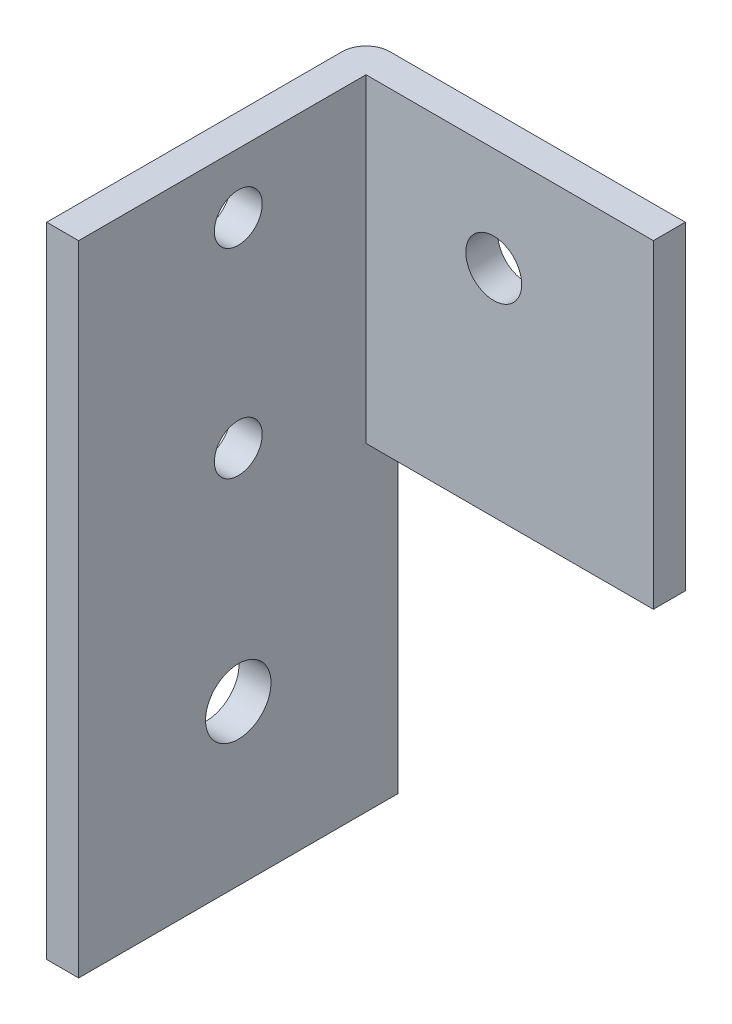
ISO-10303-21;
HEADER;
FILE_DESCRIPTION(('STEP AP214'),'2;1');
FILE_NAME('part.step','',(''),(''),'','','');
FILE_SCHEMA(('AUTOMOTIVE_DESIGN { 1 0 10303 214 1 1 1 1 }'));
ENDSEC;
DATA;
#1=APPLICATION_CONTEXT('core data for automotive mechanical design processes');
#2=APPLICATION_PROTOCOL_DEFINITION('international standard','automotive_design',2000,#1);
#3=PRODUCT_CONTEXT('',#1,'mechanical');
#4=PRODUCT('Part','Part','',(#3));
#5=PRODUCT_RELATED_PRODUCT_CATEGORY('part','',(#4));
#6=PRODUCT_DEFINITION_FORMATION('','',#4);
#7=PRODUCT_DEFINITION_CONTEXT('part definition',#1,'design');
#8=PRODUCT_DEFINITION('design','',#6,#7);
#9=PRODUCT_DEFINITION_SHAPE('','',#8);
#10=(LENGTH_UNIT() NAMED_UNIT(*) SI_UNIT(.MILLI.,.METRE.));
#11=(NAMED_UNIT(*) PLANE_ANGLE_UNIT() SI_UNIT($,.RADIAN.));
#12=(NAMED_UNIT(*) SI_UNIT($,.STERADIAN.) SOLID_ANGLE_UNIT());
#13=UNCERTAINTY_MEASURE_WITH_UNIT(LENGTH_MEASURE(1.E-05),#10,'distance_accuracy_value','');
#14=(GEOMETRIC_REPRESENTATION_CONTEXT(3) GLOBAL_UNCERTAINTY_ASSIGNED_CONTEXT((#13)) GLOBAL_UNIT_ASSIGNED_CONTEXT((#10,
#11,#12)) REPRESENTATION_CONTEXT('',''));
#15=CARTESIAN_POINT('',(0.,0.,0.));
#16=DIRECTION('',(0.,0.,1.));
#17=DIRECTION('',(1.,0.,0.));
#18=AXIS2_PLACEMENT_3D('',#15,#16,#17);
#19=CARTESIAN_POINT('',(-19.6589595375722,80.,-19.121387283237));
#20=DIRECTION('',(0.,0.,-1.));
#21=DIRECTION('',(-1.,0.,0.));
#22=AXIS2_PLACEMENT_3D('',#19,#20,#21);
#23=PLANE('',#22);
#24=CARTESIAN_POINT('',(-2.65895953757226,67.,-19.121387283237));
#25=DIRECTION('',(0.,0.,-1.));
#26=DIRECTION('',(-1.,0.,0.));
#27=AXIS2_PLACEMENT_3D('',#24,#25,#26);
#28=CIRCLE('',#27,3.49999999999999);
#29=CARTESIAN_POINT('',(-6.15895953757225,67.,-19.121387283237));
#30=VERTEX_POINT('',#29);
#31=EDGE_CURVE('E183',#30,#30,#28,.T.);
#32=ORIENTED_EDGE('',*,*,#31,.T.);
#33=EDGE_LOOP('',(#32));
#34=FACE_BOUND('',#33,.T.);
#35=DIRECTION('',(0.,-1.,0.));
#36=VECTOR('',#35,1.);
#37=CARTESIAN_POINT('',(-18.6589595375723,80.,-19.121387283237));
#38=LINE('',#37,#36);
#39=CARTESIAN_POINT('',(-18.6589595375723,80.,-19.121387283237));
#40=VERTEX_POINT('',#39);
#41=CARTESIAN_POINT('',(-18.6589595375723,40.,-19.121387283237));
#42=VERTEX_POINT('',#41);
#43=EDGE_CURVE('E114',#40,#42,#38,.T.);
#44=ORIENTED_EDGE('',*,*,#43,.T.);
#45=DIRECTION('',(1.,0.,0.));
#46=VECTOR('',#45,1.);
#47=CARTESIAN_POINT('',(-19.6589595375722,40.,-19.121387283237));
#48=LINE('',#47,#46);
#49=CARTESIAN_POINT('',(17.3410404624277,40.,-19.121387283237));
#50=VERTEX_POINT('',#49);
#51=EDGE_CURVE('E196',#42,#50,#48,.T.);
#52=ORIENTED_EDGE('',*,*,#51,.T.);
#53=DIRECTION('',(0.,-1.,0.));
#54=VECTOR('',#53,1.);
#55=CARTESIAN_POINT('',(17.3410404624277,80.,-19.121387283237));
#56=LINE('',#55,#54);
#57=CARTESIAN_POINT('',(17.3410404624277,80.,-19.121387283237));
#58=VERTEX_POINT('',#57);
#59=EDGE_CURVE('E11',#58,#50,#56,.T.);
#60=ORIENTED_EDGE('',*,*,#59,.F.);
#61=DIRECTION('',(1.,0.,0.));
#62=VECTOR('',#61,1.);
#63=CARTESIAN_POINT('',(-19.6589595375722,80.,-19.121387283237));
#64=LINE('',#63,#62);
#65=EDGE_CURVE('E83',#40,#58,#64,.T.);
#66=ORIENTED_EDGE('',*,*,#65,.F.);
#67=EDGE_LOOP('',(#44,#52,#60,#66));
#68=FACE_BOUND('',#67,.T.);
#69=ADVANCED_FACE('F34',(#34,#68),#23,.F.);
#70=CARTESIAN_POINT('',(17.3410404624277,80.,-23.121387283237));
#71=DIRECTION('',(1.,0.,0.));
#72=DIRECTION('',(0.,0.,-1.));
#73=AXIS2_PLACEMENT_3D('',#70,#71,#72);
#74=PLANE('',#73);
#75=DIRECTION('',(0.,0.,1.));
#76=VECTOR('',#75,1.);
#77=CARTESIAN_POINT('',(17.3410404624277,40.,-23.121387283237));
#78=LINE('',#77,#76);
#79=CARTESIAN_POINT('',(17.3410404624277,40.,-23.121387283237));
#80=VERTEX_POINT('',#79);
#81=EDGE_CURVE('E194',#80,#50,#78,.T.);
#82=ORIENTED_EDGE('',*,*,#81,.F.);
#83=DIRECTION('',(0.,-1.,0.));
#84=VECTOR('',#83,1.);
#85=CARTESIAN_POINT('',(17.3410404624277,80.,-23.121387283237));
#86=LINE('',#85,#84);
#87=CARTESIAN_POINT('',(17.3410404624277,80.,-23.121387283237));
#88=VERTEX_POINT('',#87);
#89=EDGE_CURVE('E43',#88,#80,#86,.T.);
#90=ORIENTED_EDGE('',*,*,#89,.F.);
#91=DIRECTION('',(0.,0.,1.));
#92=VECTOR('',#91,1.);
#93=CARTESIAN_POINT('',(17.3410404624277,80.,-23.121387283237));
#94=LINE('',#93,#92);
#95=EDGE_CURVE('E157',#88,#58,#94,.T.);
#96=ORIENTED_EDGE('',*,*,#95,.T.);
#97=ORIENTED_EDGE('',*,*,#59,.T.);
#98=EDGE_LOOP('',(#82,#90,#96,#97));
#99=FACE_BOUND('',#98,.T.);
#100=ADVANCED_FACE('F229',(#99),#74,.T.);
#101=CARTESIAN_POINT('',(-19.6589595375722,80.,-23.121387283237));
#102=DIRECTION('',(0.,0.,-1.));
#103=DIRECTION('',(-1.,0.,0.));
#104=AXIS2_PLACEMENT_3D('',#101,#102,#103);
#105=PLANE('',#104);
#106=CARTESIAN_POINT('',(-2.65895953757226,67.,-23.121387283237));
#107=DIRECTION('',(0.,0.,-1.));
#108=DIRECTION('',(-1.,0.,0.));
#109=AXIS2_PLACEMENT_3D('',#106,#107,#108);
#110=CIRCLE('',#109,3.5);
#111=CARTESIAN_POINT('',(-6.15895953757226,67.,-23.121387283237));
#112=VERTEX_POINT('',#111);
#113=EDGE_CURVE('E188',#112,#112,#110,.T.);
#114=ORIENTED_EDGE('',*,*,#113,.F.);
#115=EDGE_LOOP('',(#114));
#116=FACE_BOUND('',#115,.T.);
#117=DIRECTION('',(0.,1.,0.));
#118=VECTOR('',#117,1.);
#119=CARTESIAN_POINT('',(-18.6589595375723,40.,-23.121387283237));
#120=LINE('',#119,#118);
#121=CARTESIAN_POINT('',(-18.6589595375723,0.,-23.121387283237));
#122=VERTEX_POINT('',#121);
#123=CARTESIAN_POINT('',(-18.6589595375723,40.,-23.121387283237));
#124=VERTEX_POINT('',#123);
#125=EDGE_CURVE('E175',#122,#124,#120,.T.);
#126=ORIENTED_EDGE('',*,*,#125,.F.);
#127=DIRECTION('',(1.,0.,0.));
#128=VECTOR('',#127,1.);
#129=CARTESIAN_POINT('',(-19.6589595375722,0.,-23.121387283237));
#130=LINE('',#129,#128);
#131=CARTESIAN_POINT('',(-19.6589595375722,0.,-23.121387283237));
#132=VERTEX_POINT('',#131);
#133=EDGE_CURVE('E118',#132,#122,#130,.T.);
#134=ORIENTED_EDGE('',*,*,#133,.F.);
#135=DIRECTION('',(0.,-1.,0.));
#136=VECTOR('',#135,1.);
#137=CARTESIAN_POINT('',(-19.6589595375722,80.,-23.121387283237));
#138=LINE('',#137,#136);
#139=CARTESIAN_POINT('',(-19.6589595375722,80.,-23.121387283237));
#140=VERTEX_POINT('',#139);
#141=EDGE_CURVE('E134',#140,#132,#138,.T.);
#142=ORIENTED_EDGE('',*,*,#141,.F.);
#143=DIRECTION('',(1.,0.,0.));
#144=VECTOR('',#143,1.);
#145=CARTESIAN_POINT('',(-19.6589595375722,80.,-23.121387283237));
#146=LINE('',#145,#144);
#147=EDGE_CURVE('E160',#140,#88,#146,.T.);
#148=ORIENTED_EDGE('',*,*,#147,.T.);
#149=ORIENTED_EDGE('',*,*,#89,.T.);
#150=DIRECTION('',(1.,0.,0.));
#151=VECTOR('',#150,1.);
#152=CARTESIAN_POINT('',(38.7535883869143,40.,-23.121387283237));
#153=LINE('',#152,#151);
#154=EDGE_CURVE('E182',#124,#80,#153,.T.);
#155=ORIENTED_EDGE('',*,*,#154,.F.);
#156=EDGE_LOOP('',(#126,#134,#142,#148,#149,#155));
#157=FACE_BOUND('',#156,.T.);
#158=ADVANCED_FACE('F180',(#116,#157),#105,.T.);
#159=CARTESIAN_POINT('',(-19.6589595375723,80.,-20.121387283237));
#160=DIRECTION('',(0.,-1.,0.));
#161=DIRECTION('',(0.,0.,-1.));
#162=AXIS2_PLACEMENT_3D('',#159,#160,#161);
#163=CYLINDRICAL_SURFACE('',#162,3.);
#164=CARTESIAN_POINT('',(-19.6589595375723,0.,-20.121387283237));
#165=DIRECTION('',(0.,-1.,0.));
#166=DIRECTION('',(0.,0.,-1.));
#167=AXIS2_PLACEMENT_3D('',#164,#165,#166);
#168=CIRCLE('',#167,3.);
#169=CARTESIAN_POINT('',(-22.6589595375723,0.,-20.121387283237));
#170=VERTEX_POINT('',#169);
#171=EDGE_CURVE('E121',#170,#132,#168,.T.);
#172=ORIENTED_EDGE('',*,*,#171,.F.);
#173=DIRECTION('',(0.,-1.,0.));
#174=VECTOR('',#173,1.);
#175=CARTESIAN_POINT('',(-22.6589595375723,80.,-20.121387283237));
#176=LINE('',#175,#174);
#177=CARTESIAN_POINT('',(-22.6589595375723,80.,-20.121387283237));
#178=VERTEX_POINT('',#177);
#179=EDGE_CURVE('E103',#178,#170,#176,.T.);
#180=ORIENTED_EDGE('',*,*,#179,.F.);
#181=CARTESIAN_POINT('',(-19.6589595375723,80.,-20.121387283237));
#182=DIRECTION('',(0.,-1.,0.));
#183=DIRECTION('',(0.,0.,-1.));
#184=AXIS2_PLACEMENT_3D('',#181,#182,#183);
#185=CIRCLE('',#184,3.);
#186=EDGE_CURVE('E110',#178,#140,#185,.T.);
#187=ORIENTED_EDGE('',*,*,#186,.T.);
#188=ORIENTED_EDGE('',*,*,#141,.T.);
#189=EDGE_LOOP('',(#172,#180,#187,#188));
#190=FACE_BOUND('',#189,.T.);
#191=ADVANCED_FACE('F164',(#190),#163,.T.);
#192=CARTESIAN_POINT('',(-22.6589595375723,80.,16.878612716763));
#193=DIRECTION('',(-1.,0.,0.));
#194=DIRECTION('',(0.,0.,1.));
#195=AXIS2_PLACEMENT_3D('',#192,#193,#194);
#196=PLANE('',#195);
#197=CARTESIAN_POINT('',(-22.6589595375723,72.5,-3.12138728323695));
#198=DIRECTION('',(-1.,0.,0.));
#199=DIRECTION('',(0.,0.,1.));
#200=AXIS2_PLACEMENT_3D('',#197,#198,#199);
#201=CIRCLE('',#200,3.);
#202=CARTESIAN_POINT('',(-22.6589595375723,72.5,-0.12138728323695));
#203=VERTEX_POINT('',#202);
#204=EDGE_CURVE('E152',#203,#203,#201,.T.);
#205=ORIENTED_EDGE('',*,*,#204,.F.);
#206=EDGE_LOOP('',(#205));
#207=FACE_BOUND('',#206,.T.);
#208=CARTESIAN_POINT('',(-22.6589595375723,47.5,-3.12138728323695));
#209=DIRECTION('',(-1.,0.,0.));
#210=DIRECTION('',(0.,0.,1.));
#211=AXIS2_PLACEMENT_3D('',#208,#209,#210);
#212=CIRCLE('',#211,3.);
#213=CARTESIAN_POINT('',(-22.6589595375723,47.5,-0.121387283236947));
#214=VERTEX_POINT('',#213);
#215=EDGE_CURVE('E142',#214,#214,#212,.T.);
#216=ORIENTED_EDGE('',*,*,#215,.F.);
#217=EDGE_LOOP('',(#216));
#218=FACE_BOUND('',#217,.T.);
#219=CARTESIAN_POINT('',(-22.6589595375723,20.,-3.121387283237));
#220=DIRECTION('',(-1.,0.,0.));
#221=DIRECTION('',(0.,0.,1.));
#222=AXIS2_PLACEMENT_3D('',#219,#220,#221);
#223=CIRCLE('',#222,4.1);
#224=CARTESIAN_POINT('',(-22.6589595375723,20.,0.978612716763));
#225=VERTEX_POINT('',#224);
#226=EDGE_CURVE('E139',#225,#225,#223,.T.);
#227=ORIENTED_EDGE('',*,*,#226,.F.);
#228=EDGE_LOOP('',(#227));
#229=FACE_BOUND('',#228,.T.);
#230=DIRECTION('',(0.,0.,-1.));
#231=VECTOR('',#230,1.);
#232=CARTESIAN_POINT('',(-22.6589595375723,0.,16.878612716763));
#233=LINE('',#232,#231);
#234=CARTESIAN_POINT('',(-22.6589595375723,0.,16.878612716763));
#235=VERTEX_POINT('',#234);
#236=EDGE_CURVE('E101',#235,#170,#233,.T.);
#237=ORIENTED_EDGE('',*,*,#236,.F.);
#238=DIRECTION('',(0.,-1.,0.));
#239=VECTOR('',#238,1.);
#240=CARTESIAN_POINT('',(-22.6589595375723,80.,16.878612716763));
#241=LINE('',#240,#239);
#242=CARTESIAN_POINT('',(-22.6589595375723,80.,16.878612716763));
#243=VERTEX_POINT('',#242);
#244=EDGE_CURVE('E71',#243,#235,#241,.T.);
#245=ORIENTED_EDGE('',*,*,#244,.F.);
#246=DIRECTION('',(0.,0.,-1.));
#247=VECTOR('',#246,1.);
#248=CARTESIAN_POINT('',(-22.6589595375723,80.,16.878612716763));
#249=LINE('',#248,#247);
#250=EDGE_CURVE('E99',#243,#178,#249,.T.);
#251=ORIENTED_EDGE('',*,*,#250,.T.);
#252=ORIENTED_EDGE('',*,*,#179,.T.);
#253=EDGE_LOOP('',(#237,#245,#251,#252));
#254=FACE_BOUND('',#253,.T.);
#255=ADVANCED_FACE('F98',(#207,#218,#229,#254),#196,.T.);
#256=CARTESIAN_POINT('',(-18.6589595375723,80.,16.878612716763));
#257=DIRECTION('',(0.,0.,1.));
#258=DIRECTION('',(1.,0.,0.));
#259=AXIS2_PLACEMENT_3D('',#256,#257,#258);
#260=PLANE('',#259);
#261=DIRECTION('',(-1.,0.,0.));
#262=VECTOR('',#261,1.);
#263=CARTESIAN_POINT('',(-18.6589595375723,0.,16.878612716763));
#264=LINE('',#263,#262);
#265=CARTESIAN_POINT('',(-18.6589595375723,0.,16.878612716763));
#266=VERTEX_POINT('',#265);
#267=EDGE_CURVE('E126',#266,#235,#264,.T.);
#268=ORIENTED_EDGE('',*,*,#267,.F.);
#269=DIRECTION('',(0.,-1.,0.));
#270=VECTOR('',#269,1.);
#271=CARTESIAN_POINT('',(-18.6589595375723,80.,16.878612716763));
#272=LINE('',#271,#270);
#273=CARTESIAN_POINT('',(-18.6589595375723,80.,16.878612716763));
#274=VERTEX_POINT('',#273);
#275=EDGE_CURVE('E77',#274,#266,#272,.T.);
#276=ORIENTED_EDGE('',*,*,#275,.F.);
#277=DIRECTION('',(-1.,0.,0.));
#278=VECTOR('',#277,1.);
#279=CARTESIAN_POINT('',(-18.6589595375723,80.,16.878612716763));
#280=LINE('',#279,#278);
#281=EDGE_CURVE('E107',#274,#243,#280,.T.);
#282=ORIENTED_EDGE('',*,*,#281,.T.);
#283=ORIENTED_EDGE('',*,*,#244,.T.);
#284=EDGE_LOOP('',(#268,#276,#282,#283));
#285=FACE_BOUND('',#284,.T.);
#286=ADVANCED_FACE('F112',(#285),#260,.T.);
#287=CARTESIAN_POINT('',(-18.6589595375723,80.,16.878612716763));
#288=DIRECTION('',(-1.,0.,0.));
#289=DIRECTION('',(0.,0.,1.));
#290=AXIS2_PLACEMENT_3D('',#287,#288,#289);
#291=PLANE('',#290);
#292=DIRECTION('',(0.,0.,-1.));
#293=VECTOR('',#292,1.);
#294=CARTESIAN_POINT('',(-18.6589595375723,0.,16.878612716763));
#295=LINE('',#294,#293);
#296=EDGE_CURVE('E128',#266,#122,#295,.T.);
#297=ORIENTED_EDGE('',*,*,#296,.T.);
#298=ORIENTED_EDGE('',*,*,#125,.T.);
#299=DIRECTION('',(0.,0.,-1.));
#300=VECTOR('',#299,1.);
#301=CARTESIAN_POINT('',(-18.6589595375723,40.,-13.121387283237));
#302=LINE('',#301,#300);
#303=EDGE_CURVE('E185',#42,#124,#302,.T.);
#304=ORIENTED_EDGE('',*,*,#303,.F.);
#305=ORIENTED_EDGE('',*,*,#43,.F.);
#306=DIRECTION('',(0.,0.,-1.));
#307=VECTOR('',#306,1.);
#308=CARTESIAN_POINT('',(-18.6589595375723,80.,16.878612716763));
#309=LINE('',#308,#307);
#310=EDGE_CURVE('E52',#274,#40,#309,.T.);
#311=ORIENTED_EDGE('',*,*,#310,.F.);
#312=ORIENTED_EDGE('',*,*,#275,.T.);
#313=EDGE_LOOP('',(#297,#298,#304,#305,#311,#312));
#314=FACE_BOUND('',#313,.T.);
#315=CARTESIAN_POINT('',(-18.6589595375723,72.5,-3.12138728323695));
#316=DIRECTION('',(-1.,0.,0.));
#317=DIRECTION('',(0.,0.,1.));
#318=AXIS2_PLACEMENT_3D('',#315,#316,#317);
#319=CIRCLE('',#318,3.);
#320=CARTESIAN_POINT('',(-18.6589595375723,72.5,-0.12138728323695));
#321=VERTEX_POINT('',#320);
#322=EDGE_CURVE('E37',#321,#321,#319,.T.);
#323=ORIENTED_EDGE('',*,*,#322,.T.);
#324=EDGE_LOOP('',(#323));
#325=FACE_BOUND('',#324,.T.);
#326=CARTESIAN_POINT('',(-18.6589595375723,47.5,-3.12138728323695));
#327=DIRECTION('',(-1.,0.,0.));
#328=DIRECTION('',(0.,0.,1.));
#329=AXIS2_PLACEMENT_3D('',#326,#327,#328);
#330=CIRCLE('',#329,3.);
#331=CARTESIAN_POINT('',(-18.6589595375723,47.5,-0.121387283236947));
#332=VERTEX_POINT('',#331);
#333=EDGE_CURVE('E140',#332,#332,#330,.T.);
#334=ORIENTED_EDGE('',*,*,#333,.T.);
#335=EDGE_LOOP('',(#334));
#336=FACE_BOUND('',#335,.T.);
#337=CARTESIAN_POINT('',(-18.6589595375723,20.,-3.121387283237));
#338=DIRECTION('',(-1.,0.,0.));
#339=DIRECTION('',(0.,0.,1.));
#340=AXIS2_PLACEMENT_3D('',#337,#338,#339);
#341=CIRCLE('',#340,4.1);
#342=CARTESIAN_POINT('',(-18.6589595375723,20.,0.978612716763));
#343=VERTEX_POINT('',#342);
#344=EDGE_CURVE('E122',#343,#343,#341,.T.);
#345=ORIENTED_EDGE('',*,*,#344,.T.);
#346=EDGE_LOOP('',(#345));
#347=FACE_BOUND('',#346,.T.);
#348=ADVANCED_FACE('F171',(#314,#325,#336,#347),#291,.F.);
#349=CARTESIAN_POINT('',(-19.6589595375723,80.,-20.121387283237));
#350=DIRECTION('',(0.,-1.,0.));
#351=DIRECTION('',(-1.,0.,0.));
#352=AXIS2_PLACEMENT_3D('',#349,#350,#351);
#353=PLANE('',#352);
#354=ORIENTED_EDGE('',*,*,#65,.T.);
#355=ORIENTED_EDGE('',*,*,#95,.F.);
#356=ORIENTED_EDGE('',*,*,#147,.F.);
#357=ORIENTED_EDGE('',*,*,#186,.F.);
#358=ORIENTED_EDGE('',*,*,#250,.F.);
#359=ORIENTED_EDGE('',*,*,#281,.F.);
#360=ORIENTED_EDGE('',*,*,#310,.T.);
#361=EDGE_LOOP('',(#354,#355,#356,#357,#358,#359,#360));
#362=FACE_BOUND('',#361,.T.);
#363=ADVANCED_FACE('F106',(#362),#353,.F.);
#364=CARTESIAN_POINT('',(-19.6589595375723,0.,-20.121387283237));
#365=DIRECTION('',(0.,-1.,0.));
#366=DIRECTION('',(-1.,0.,0.));
#367=AXIS2_PLACEMENT_3D('',#364,#365,#366);
#368=PLANE('',#367);
#369=ORIENTED_EDGE('',*,*,#133,.T.);
#370=ORIENTED_EDGE('',*,*,#296,.F.);
#371=ORIENTED_EDGE('',*,*,#267,.T.);
#372=ORIENTED_EDGE('',*,*,#236,.T.);
#373=ORIENTED_EDGE('',*,*,#171,.T.);
#374=EDGE_LOOP('',(#369,#370,#371,#372,#373));
#375=FACE_BOUND('',#374,.T.);
#376=ADVANCED_FACE('F167',(#375),#368,.T.);
#377=CARTESIAN_POINT('',(-12.6589595375723,20.,-3.121387283237));
#378=DIRECTION('',(-1.,0.,0.));
#379=DIRECTION('',(0.,0.,1.));
#380=AXIS2_PLACEMENT_3D('',#377,#378,#379);
#381=CYLINDRICAL_SURFACE('',#380,4.1);
#382=ORIENTED_EDGE('',*,*,#226,.T.);
#383=EDGE_LOOP('',(#382));
#384=FACE_BOUND('',#383,.T.);
#385=ORIENTED_EDGE('',*,*,#344,.F.);
#386=EDGE_LOOP('',(#385));
#387=FACE_BOUND('',#386,.T.);
#388=ADVANCED_FACE('F212',(#384,#387),#381,.F.);
#389=CARTESIAN_POINT('',(-12.6589595375723,47.5,-3.12138728323695));
#390=DIRECTION('',(-1.,0.,0.));
#391=DIRECTION('',(0.,0.,1.));
#392=AXIS2_PLACEMENT_3D('',#389,#390,#391);
#393=CYLINDRICAL_SURFACE('',#392,3.);
#394=ORIENTED_EDGE('',*,*,#215,.T.);
#395=EDGE_LOOP('',(#394));
#396=FACE_BOUND('',#395,.T.);
#397=ORIENTED_EDGE('',*,*,#333,.F.);
#398=EDGE_LOOP('',(#397));
#399=FACE_BOUND('',#398,.T.);
#400=ADVANCED_FACE('F215',(#396,#399),#393,.F.);
#401=CARTESIAN_POINT('',(-12.6589595375723,72.5,-3.12138728323695));
#402=DIRECTION('',(-1.,0.,0.));
#403=DIRECTION('',(0.,0.,1.));
#404=AXIS2_PLACEMENT_3D('',#401,#402,#403);
#405=CYLINDRICAL_SURFACE('',#404,3.);
#406=ORIENTED_EDGE('',*,*,#204,.T.);
#407=EDGE_LOOP('',(#406));
#408=FACE_BOUND('',#407,.T.);
#409=ORIENTED_EDGE('',*,*,#322,.F.);
#410=EDGE_LOOP('',(#409));
#411=FACE_BOUND('',#410,.T.);
#412=ADVANCED_FACE('F203',(#408,#411),#405,.F.);
#413=CARTESIAN_POINT('',(38.7535883869143,40.,-13.121387283237));
#414=DIRECTION('',(0.,1.,0.));
#415=DIRECTION('',(0.,0.,1.));
#416=AXIS2_PLACEMENT_3D('',#413,#414,#415);
#417=PLANE('',#416);
#418=ORIENTED_EDGE('',*,*,#303,.T.);
#419=ORIENTED_EDGE('',*,*,#154,.T.);
#420=ORIENTED_EDGE('',*,*,#81,.T.);
#421=ORIENTED_EDGE('',*,*,#51,.F.);
#422=EDGE_LOOP('',(#418,#419,#420,#421));
#423=FACE_BOUND('',#422,.T.);
#424=ADVANCED_FACE('F238',(#423),#417,.F.);
#425=CARTESIAN_POINT('',(-2.65895953757226,67.,-23.121387283237));
#426=DIRECTION('',(0.,0.,-1.));
#427=DIRECTION('',(-1.,0.,0.));
#428=AXIS2_PLACEMENT_3D('',#425,#426,#427);
#429=CYLINDRICAL_SURFACE('',#428,3.49999999999999);
#430=ORIENTED_EDGE('',*,*,#113,.T.);
#431=EDGE_LOOP('',(#430));
#432=FACE_BOUND('',#431,.T.);
#433=ORIENTED_EDGE('',*,*,#31,.F.);
#434=EDGE_LOOP('',(#433));
#435=FACE_BOUND('',#434,.T.);
#436=ADVANCED_FACE('F243',(#432,#435),#429,.F.);
#437=CLOSED_SHELL('',(#69,#100,#158,#191,#255,#286,#348,#363,#376,#388,#400,#412,#424,#436));
#438=MANIFOLD_SOLID_BREP('B2',#437);
#439=ADVANCED_BREP_SHAPE_REPRESENTATION('',(#18,#438),#14);
#440=SHAPE_DEFINITION_REPRESENTATION(#9,#439);
ENDSEC;
END-ISO-10303-21;
